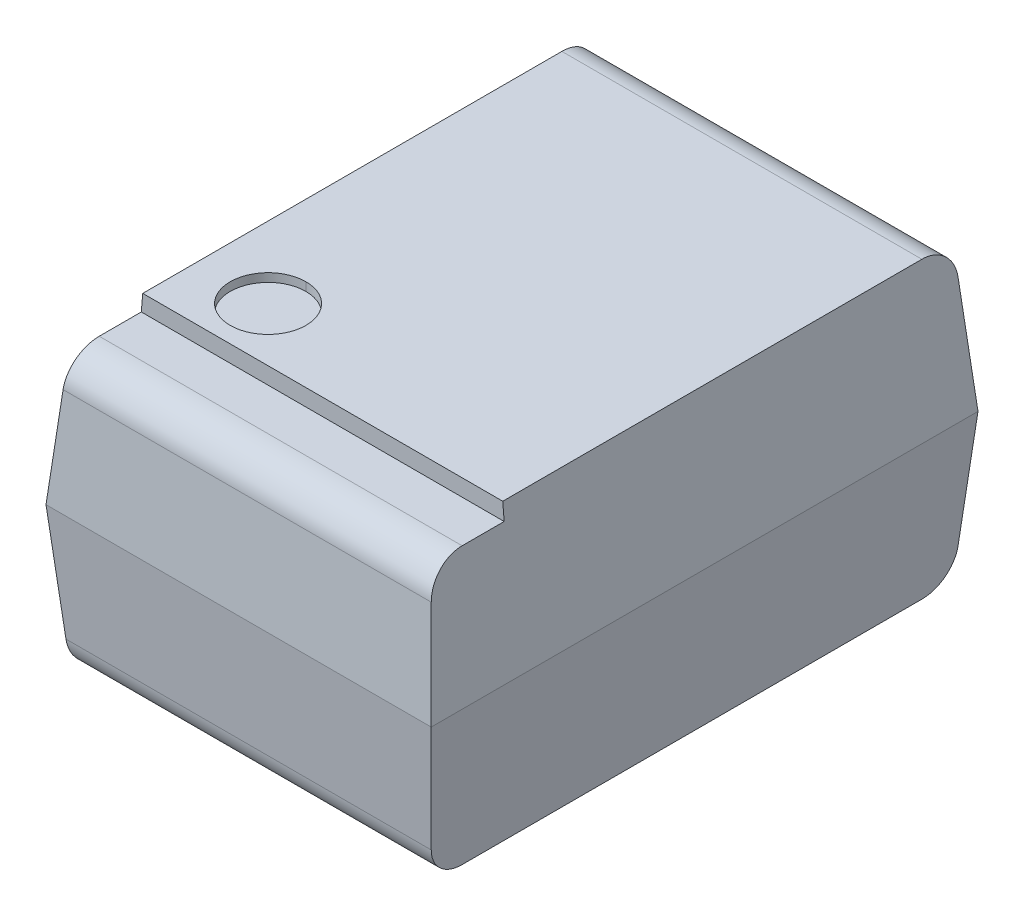
ISO-10303-21;
HEADER;
FILE_DESCRIPTION(('STEP AP214'),'2;1');
FILE_NAME('part.step','',(''),(''),'','','');
FILE_SCHEMA(('AUTOMOTIVE_DESIGN { 1 0 10303 214 1 1 1 1 }'));
ENDSEC;
DATA;
#1=APPLICATION_CONTEXT('core data for automotive mechanical design processes');
#2=APPLICATION_PROTOCOL_DEFINITION('international standard','automotive_design',2000,#1);
#3=PRODUCT_CONTEXT('',#1,'mechanical');
#4=PRODUCT('Part','Part','',(#3));
#5=PRODUCT_RELATED_PRODUCT_CATEGORY('part','',(#4));
#6=PRODUCT_DEFINITION_FORMATION('','',#4);
#7=PRODUCT_DEFINITION_CONTEXT('part definition',#1,'design');
#8=PRODUCT_DEFINITION('design','',#6,#7);
#9=PRODUCT_DEFINITION_SHAPE('','',#8);
#10=(LENGTH_UNIT() NAMED_UNIT(*) SI_UNIT(.MILLI.,.METRE.));
#11=(NAMED_UNIT(*) PLANE_ANGLE_UNIT() SI_UNIT($,.RADIAN.));
#12=(NAMED_UNIT(*) SI_UNIT($,.STERADIAN.) SOLID_ANGLE_UNIT());
#13=UNCERTAINTY_MEASURE_WITH_UNIT(LENGTH_MEASURE(1.E-05),#10,'distance_accuracy_value','');
#14=(GEOMETRIC_REPRESENTATION_CONTEXT(3) GLOBAL_UNCERTAINTY_ASSIGNED_CONTEXT((#13)) GLOBAL_UNIT_ASSIGNED_CONTEXT((#10,
#11,#12)) REPRESENTATION_CONTEXT('',''));
#15=CARTESIAN_POINT('',(0.,0.,0.));
#16=DIRECTION('',(0.,0.,1.));
#17=DIRECTION('',(1.,0.,0.));
#18=AXIS2_PLACEMENT_3D('',#15,#16,#17);
#19=CARTESIAN_POINT('',(-1.29,10.4377154649539,1.61));
#20=DIRECTION('',(0.,-1.,0.));
#21=DIRECTION('',(0.,0.,-1.));
#22=AXIS2_PLACEMENT_3D('',#19,#20,#21);
#23=CYLINDRICAL_SURFACE('',#22,0.45);
#24=CARTESIAN_POINT('',(-1.29,1.75,1.61));
#25=DIRECTION('',(0.,-1.,0.));
#26=DIRECTION('',(0.,0.,-1.));
#27=AXIS2_PLACEMENT_3D('',#24,#25,#26);
#28=CIRCLE('',#27,0.45);
#29=CARTESIAN_POINT('',(-1.29,1.75,2.06));
#30=VERTEX_POINT('',#29);
#31=CARTESIAN_POINT('',(-1.29,1.75,1.16));
#32=VERTEX_POINT('',#31);
#33=EDGE_CURVE('E11',#30,#32,#28,.T.);
#34=ORIENTED_EDGE('',*,*,#33,.F.);
#35=DIRECTION('',(0.,-1.,0.));
#36=VECTOR('',#35,1.);
#37=CARTESIAN_POINT('',(-1.29,10.4377154649539,2.06));
#38=LINE('',#37,#36);
#39=CARTESIAN_POINT('',(-1.29,1.65,2.06));
#40=VERTEX_POINT('',#39);
#41=EDGE_CURVE('E24',#30,#40,#38,.T.);
#42=ORIENTED_EDGE('',*,*,#41,.T.);
#43=CARTESIAN_POINT('',(-1.29,1.65,1.61));
#44=DIRECTION('',(0.,1.,0.));
#45=DIRECTION('',(0.,0.,-1.));
#46=AXIS2_PLACEMENT_3D('',#43,#44,#45);
#47=CIRCLE('',#46,0.45);
#48=CARTESIAN_POINT('',(-1.29,1.65,1.16));
#49=VERTEX_POINT('',#48);
#50=EDGE_CURVE('E305',#49,#40,#47,.T.);
#51=ORIENTED_EDGE('',*,*,#50,.F.);
#52=DIRECTION('',(0.,-1.,0.));
#53=VECTOR('',#52,1.);
#54=CARTESIAN_POINT('',(-1.29,10.4377154649539,1.16));
#55=LINE('',#54,#53);
#56=EDGE_CURVE('E37',#32,#49,#55,.T.);
#57=ORIENTED_EDGE('',*,*,#56,.F.);
#58=EDGE_LOOP('',(#34,#42,#51,#57));
#59=FACE_BOUND('',#58,.T.);
#60=ADVANCED_FACE('F17',(#59),#23,.F.);
#61=CARTESIAN_POINT('',(0.,-10.4377154649539,0.));
#62=DIRECTION('',(0.,1.,0.));
#63=DIRECTION('',(0.,0.,1.));
#64=AXIS2_PLACEMENT_3D('',#61,#62,#63);
#65=CYLINDRICAL_SURFACE('',#64,1.5);
#66=CARTESIAN_POINT('',(0.,-1.75,0.));
#67=DIRECTION('',(0.,-1.,0.));
#68=DIRECTION('',(0.,0.,1.));
#69=AXIS2_PLACEMENT_3D('',#66,#67,#68);
#70=CIRCLE('',#69,1.5);
#71=CARTESIAN_POINT('',(0.,-1.75,1.5));
#72=VERTEX_POINT('',#71);
#73=CARTESIAN_POINT('',(0.,-1.75,-1.5));
#74=VERTEX_POINT('',#73);
#75=EDGE_CURVE('E301',#72,#74,#70,.T.);
#76=ORIENTED_EDGE('',*,*,#75,.T.);
#77=DIRECTION('',(0.,1.,0.));
#78=VECTOR('',#77,1.);
#79=CARTESIAN_POINT('',(0.,-10.4377154649539,-1.5));
#80=LINE('',#79,#78);
#81=CARTESIAN_POINT('',(0.,-1.65,-1.5));
#82=VERTEX_POINT('',#81);
#83=EDGE_CURVE('E298',#74,#82,#80,.T.);
#84=ORIENTED_EDGE('',*,*,#83,.T.);
#85=CARTESIAN_POINT('',(0.,-1.65,0.));
#86=DIRECTION('',(0.,-1.,0.));
#87=DIRECTION('',(0.,0.,1.));
#88=AXIS2_PLACEMENT_3D('',#85,#86,#87);
#89=CIRCLE('',#88,1.5);
#90=CARTESIAN_POINT('',(0.,-1.65,1.5));
#91=VERTEX_POINT('',#90);
#92=EDGE_CURVE('E296',#91,#82,#89,.T.);
#93=ORIENTED_EDGE('',*,*,#92,.F.);
#94=DIRECTION('',(0.,1.,0.));
#95=VECTOR('',#94,1.);
#96=CARTESIAN_POINT('',(0.,-10.4377154649539,1.5));
#97=LINE('',#96,#95);
#98=EDGE_CURVE('E294',#72,#91,#97,.T.);
#99=ORIENTED_EDGE('',*,*,#98,.F.);
#100=EDGE_LOOP('',(#76,#84,#93,#99));
#101=FACE_BOUND('',#100,.T.);
#102=ADVANCED_FACE('F325',(#101),#65,.F.);
#103=CARTESIAN_POINT('',(0.,1.75,0.));
#104=DIRECTION('',(0.,1.,0.));
#105=DIRECTION('',(0.,0.,1.));
#106=AXIS2_PLACEMENT_3D('',#103,#104,#105);
#107=PLANE('',#106);
#108=CARTESIAN_POINT('',(-1.29,1.75,1.61));
#109=DIRECTION('',(0.,-1.,0.));
#110=DIRECTION('',(0.,0.,-1.));
#111=AXIS2_PLACEMENT_3D('',#108,#109,#110);
#112=CIRCLE('',#111,0.45);
#113=EDGE_CURVE('E291',#32,#30,#112,.T.);
#114=ORIENTED_EDGE('',*,*,#113,.T.);
#115=ORIENTED_EDGE('',*,*,#33,.T.);
#116=EDGE_LOOP('',(#114,#115));
#117=FACE_BOUND('',#116,.T.);
#118=DIRECTION('',(1.,0.,0.));
#119=VECTOR('',#118,1.);
#120=CARTESIAN_POINT('',(0.,1.75,2.25));
#121=LINE('',#120,#119);
#122=CARTESIAN_POINT('',(-2.14,1.75,2.25));
#123=VERTEX_POINT('',#122);
#124=CARTESIAN_POINT('',(2.14,1.75,2.25));
#125=VERTEX_POINT('',#124);
#126=EDGE_CURVE('E289',#123,#125,#121,.T.);
#127=ORIENTED_EDGE('',*,*,#126,.T.);
#128=DIRECTION('',(0.,0.,-1.));
#129=VECTOR('',#128,1.);
#130=CARTESIAN_POINT('',(2.14,1.75,0.));
#131=LINE('',#130,#129);
#132=CARTESIAN_POINT('',(2.14,1.75,-2.73281901553713));
#133=VERTEX_POINT('',#132);
#134=EDGE_CURVE('E287',#125,#133,#131,.T.);
#135=ORIENTED_EDGE('',*,*,#134,.T.);
#136=DIRECTION('',(-1.,0.,0.));
#137=VECTOR('',#136,1.);
#138=CARTESIAN_POINT('',(0.,1.75,-2.73281901553713));
#139=LINE('',#138,#137);
#140=CARTESIAN_POINT('',(-2.14,1.75,-2.73281901553713));
#141=VERTEX_POINT('',#140);
#142=EDGE_CURVE('E285',#133,#141,#139,.T.);
#143=ORIENTED_EDGE('',*,*,#142,.T.);
#144=DIRECTION('',(0.,0.,1.));
#145=VECTOR('',#144,1.);
#146=CARTESIAN_POINT('',(-2.14,1.75,0.));
#147=LINE('',#146,#145);
#148=EDGE_CURVE('E282',#141,#123,#147,.T.);
#149=ORIENTED_EDGE('',*,*,#148,.T.);
#150=EDGE_LOOP('',(#127,#135,#143,#149));
#151=FACE_BOUND('',#150,.T.);
#152=ADVANCED_FACE('F329',(#117,#151),#107,.T.);
#153=CARTESIAN_POINT('',(-1.29,10.4377154649539,1.61));
#154=DIRECTION('',(0.,-1.,0.));
#155=DIRECTION('',(0.,0.,-1.));
#156=AXIS2_PLACEMENT_3D('',#153,#154,#155);
#157=CYLINDRICAL_SURFACE('',#156,0.45);
#158=ORIENTED_EDGE('',*,*,#41,.F.);
#159=ORIENTED_EDGE('',*,*,#113,.F.);
#160=ORIENTED_EDGE('',*,*,#56,.T.);
#161=CARTESIAN_POINT('',(-1.29,1.65,1.61));
#162=DIRECTION('',(0.,1.,0.));
#163=DIRECTION('',(0.,0.,-1.));
#164=AXIS2_PLACEMENT_3D('',#161,#162,#163);
#165=CIRCLE('',#164,0.45);
#166=EDGE_CURVE('E279',#40,#49,#165,.T.);
#167=ORIENTED_EDGE('',*,*,#166,.F.);
#168=EDGE_LOOP('',(#158,#159,#160,#167));
#169=FACE_BOUND('',#168,.T.);
#170=ADVANCED_FACE('F306',(#169),#157,.F.);
#171=CARTESIAN_POINT('',(2.29,0.,3.25));
#172=DIRECTION('',(0.996346649041751,0.085401141346437,0.));
#173=DIRECTION('',(-0.085401141346437,0.996346649041751,0.));
#174=AXIS2_PLACEMENT_3D('',#171,#172,#173);
#175=PLANE('',#174);
#176=DIRECTION('',(0.,0.,-1.));
#177=VECTOR('',#176,1.);
#178=CARTESIAN_POINT('',(2.29,0.,3.25));
#179=LINE('',#178,#177);
#180=CARTESIAN_POINT('',(2.29,0.,3.25));
#181=VERTEX_POINT('',#180);
#182=CARTESIAN_POINT('',(2.29,0.,-3.25));
#183=VERTEX_POINT('',#182);
#184=EDGE_CURVE('E277',#181,#183,#179,.T.);
#185=ORIENTED_EDGE('',*,*,#184,.T.);
#186=DIRECTION('',(0.0850914041696108,-0.992733048645449,-0.0850914041696102));
#187=VECTOR('',#186,1.);
#188=CARTESIAN_POINT('',(2.17135767515384,1.38416045653857,-3.13135767515384));
#189=LINE('',#188,#187);
#190=CARTESIAN_POINT('',(2.17135767515384,1.38416045653857,-3.13135767515384));
#191=VERTEX_POINT('',#190);
#192=EDGE_CURVE('E271',#191,#183,#189,.T.);
#193=ORIENTED_EDGE('',*,*,#192,.F.);
#194=CARTESIAN_POINT('',(2.17135767515384,1.38416045653857,-3.13135767515384));
#195=CARTESIAN_POINT('',(2.15267814672051,1.60208828826077,-3.1126781467205));
#196=CARTESIAN_POINT('',(2.14,1.75,-2.9515459334545));
#197=CARTESIAN_POINT('',(2.14,1.75,-2.73281901553713));
#198=(BOUNDED_CURVE() B_SPLINE_CURVE(3,(#194,#195,#196,#197),.UNSPECIFIED.,.F.,
.F.) B_SPLINE_CURVE_WITH_KNOTS((4,4),(4.79789427406289,6.28318530717958),
.UNSPECIFIED.) CURVE() GEOMETRIC_REPRESENTATION_ITEM() RATIONAL_B_SPLINE_CURVE((1.,
0.8244547578635,0.8244547578635,1.)) REPRESENTATION_ITEM(''));
#199=EDGE_CURVE('E266',#191,#133,#198,.T.);
#200=ORIENTED_EDGE('',*,*,#199,.T.);
#201=ORIENTED_EDGE('',*,*,#134,.F.);
#202=DIRECTION('',(0.085401141346437,-0.996346649041751,0.));
#203=VECTOR('',#202,1.);
#204=CARTESIAN_POINT('',(2.29,0.,2.25));
#205=LINE('',#204,#203);
#206=CARTESIAN_POINT('',(2.15714285714285,1.55,2.25));
#207=VERTEX_POINT('',#206);
#208=EDGE_CURVE('E264',#125,#207,#205,.T.);
#209=ORIENTED_EDGE('',*,*,#208,.T.);
#210=DIRECTION('',(0.,0.,1.));
#211=VECTOR('',#210,1.);
#212=CARTESIAN_POINT('',(2.15714285714285,1.55,2.25));
#213=LINE('',#212,#211);
#214=CARTESIAN_POINT('',(2.15714285714285,1.55,2.74996187267999));
#215=VERTEX_POINT('',#214);
#216=EDGE_CURVE('E259',#207,#215,#213,.T.);
#217=ORIENTED_EDGE('',*,*,#216,.T.);
#218=CARTESIAN_POINT('',(2.18850053229669,1.18416045653857,3.14850053229669));
#219=CARTESIAN_POINT('',(2.16982100386336,1.40208828826077,3.12982100386336));
#220=CARTESIAN_POINT('',(2.15714285714285,1.55,2.96868879059736));
#221=CARTESIAN_POINT('',(2.15714285714285,1.55,2.74996187267999));
#222=(BOUNDED_CURVE() B_SPLINE_CURVE(3,(#218,#219,#220,#221),.UNSPECIFIED.,.F.,
.F.) B_SPLINE_CURVE_WITH_KNOTS((4,4),(4.7978942740629,6.28318530717959),
.UNSPECIFIED.) CURVE() GEOMETRIC_REPRESENTATION_ITEM() RATIONAL_B_SPLINE_CURVE((1.,
0.824454757863502,0.824454757863502,1.)) REPRESENTATION_ITEM(''));
#223=CARTESIAN_POINT('',(2.18850053229669,1.18416045653857,3.14850053229669));
#224=VERTEX_POINT('',#223);
#225=EDGE_CURVE('E254',#224,#215,#222,.T.);
#226=ORIENTED_EDGE('',*,*,#225,.F.);
#227=DIRECTION('',(-0.0850914041696092,0.992733048645449,-0.0850914041696103));
#228=VECTOR('',#227,1.);
#229=CARTESIAN_POINT('',(2.29,0.,3.25));
#230=LINE('',#229,#228);
#231=EDGE_CURVE('E251',#181,#224,#230,.T.);
#232=ORIENTED_EDGE('',*,*,#231,.F.);
#233=EDGE_LOOP('',(#185,#193,#200,#201,#209,#217,#226,#232));
#234=FACE_BOUND('',#233,.T.);
#235=ADVANCED_FACE('F339',(#234),#175,.T.);
#236=CARTESIAN_POINT('',(-2.291,1.75,2.25));
#237=DIRECTION('',(0.,0.,-1.));
#238=DIRECTION('',(-1.,0.,0.));
#239=AXIS2_PLACEMENT_3D('',#236,#237,#238);
#240=PLANE('',#239);
#241=DIRECTION('',(-1.,0.,0.));
#242=VECTOR('',#241,1.);
#243=CARTESIAN_POINT('',(-2.291,1.55,2.25));
#244=LINE('',#243,#242);
#245=CARTESIAN_POINT('',(-2.15714285714286,1.55,2.25));
#246=VERTEX_POINT('',#245);
#247=EDGE_CURVE('E249',#207,#246,#244,.T.);
#248=ORIENTED_EDGE('',*,*,#247,.F.);
#249=ORIENTED_EDGE('',*,*,#208,.F.);
#250=ORIENTED_EDGE('',*,*,#126,.F.);
#251=DIRECTION('',(0.0854011413464355,0.996346649041751,0.));
#252=VECTOR('',#251,1.);
#253=CARTESIAN_POINT('',(-2.15714285714286,1.55,2.25));
#254=LINE('',#253,#252);
#255=EDGE_CURVE('E243',#246,#123,#254,.T.);
#256=ORIENTED_EDGE('',*,*,#255,.F.);
#257=EDGE_LOOP('',(#248,#249,#250,#256));
#258=FACE_BOUND('',#257,.T.);
#259=ADVANCED_FACE('F342',(#258),#240,.F.);
#260=CARTESIAN_POINT('',(-2.29,0.,-3.25));
#261=DIRECTION('',(-0.996346649041751,0.085401141346436,0.));
#262=DIRECTION('',(-0.085401141346436,-0.996346649041751,0.));
#263=AXIS2_PLACEMENT_3D('',#260,#261,#262);
#264=PLANE('',#263);
#265=ORIENTED_EDGE('',*,*,#255,.T.);
#266=ORIENTED_EDGE('',*,*,#148,.F.);
#267=CARTESIAN_POINT('',(-2.14,1.75,-2.73281901553713));
#268=CARTESIAN_POINT('',(-2.14,1.75,-2.9515459334545));
#269=CARTESIAN_POINT('',(-2.1526781467205,1.60208828826077,-3.11267814672051));
#270=CARTESIAN_POINT('',(-2.17135767515384,1.38416045653857,-3.13135767515384));
#271=(BOUNDED_CURVE() B_SPLINE_CURVE(3,(#267,#268,#269,#270),.UNSPECIFIED.,.F.,
.F.) B_SPLINE_CURVE_WITH_KNOTS((4,4),(3.14159265358979,4.62688368670648),
.UNSPECIFIED.) CURVE() GEOMETRIC_REPRESENTATION_ITEM() RATIONAL_B_SPLINE_CURVE((1.,
0.824454757863501,0.824454757863501,1.)) REPRESENTATION_ITEM(''));
#272=CARTESIAN_POINT('',(-2.17135767515384,1.38416045653857,-3.13135767515384));
#273=VERTEX_POINT('',#272);
#274=EDGE_CURVE('E239',#141,#273,#271,.T.);
#275=ORIENTED_EDGE('',*,*,#274,.T.);
#276=DIRECTION('',(0.0850914041696098,0.992733048645449,0.0850914041696101));
#277=VECTOR('',#276,1.);
#278=CARTESIAN_POINT('',(-2.29,0.,-3.25));
#279=LINE('',#278,#277);
#280=CARTESIAN_POINT('',(-2.29,0.,-3.25));
#281=VERTEX_POINT('',#280);
#282=EDGE_CURVE('E236',#281,#273,#279,.T.);
#283=ORIENTED_EDGE('',*,*,#282,.F.);
#284=DIRECTION('',(0.,0.,1.));
#285=VECTOR('',#284,1.);
#286=CARTESIAN_POINT('',(-2.29,0.,-3.25));
#287=LINE('',#286,#285);
#288=CARTESIAN_POINT('',(-2.29,0.,3.25));
#289=VERTEX_POINT('',#288);
#290=EDGE_CURVE('E234',#281,#289,#287,.T.);
#291=ORIENTED_EDGE('',*,*,#290,.T.);
#292=DIRECTION('',(-0.0850914041696103,-0.992733048645449,0.0850914041696103));
#293=VECTOR('',#292,1.);
#294=CARTESIAN_POINT('',(-2.18850053229669,1.18416045653857,3.14850053229669));
#295=LINE('',#294,#293);
#296=CARTESIAN_POINT('',(-2.1885005322967,1.18416045653857,3.14850053229669));
#297=VERTEX_POINT('',#296);
#298=EDGE_CURVE('E228',#297,#289,#295,.T.);
#299=ORIENTED_EDGE('',*,*,#298,.F.);
#300=CARTESIAN_POINT('',(-2.15714285714286,1.55,2.74996187267999));
#301=CARTESIAN_POINT('',(-2.15714285714286,1.55,2.96868879059736));
#302=CARTESIAN_POINT('',(-2.16982100386336,1.40208828826077,3.12982100386336));
#303=CARTESIAN_POINT('',(-2.1885005322967,1.18416045653857,3.14850053229669));
#304=(BOUNDED_CURVE() B_SPLINE_CURVE(3,(#300,#301,#302,#303),.UNSPECIFIED.,.F.,
.F.) B_SPLINE_CURVE_WITH_KNOTS((4,4),(3.1415926535898,4.62688368670649),
.UNSPECIFIED.) CURVE() GEOMETRIC_REPRESENTATION_ITEM() RATIONAL_B_SPLINE_CURVE((1.,
0.824454757863501,0.824454757863501,1.)) REPRESENTATION_ITEM(''));
#305=CARTESIAN_POINT('',(-2.15714285714286,1.55,2.74996187267999));
#306=VERTEX_POINT('',#305);
#307=EDGE_CURVE('E223',#306,#297,#304,.T.);
#308=ORIENTED_EDGE('',*,*,#307,.F.);
#309=DIRECTION('',(0.,0.,-1.));
#310=VECTOR('',#309,1.);
#311=CARTESIAN_POINT('',(-2.15714285714286,1.55,-3.25));
#312=LINE('',#311,#310);
#313=EDGE_CURVE('E220',#306,#246,#312,.T.);
#314=ORIENTED_EDGE('',*,*,#313,.T.);
#315=EDGE_LOOP('',(#265,#266,#275,#283,#291,#299,#308,#314));
#316=FACE_BOUND('',#315,.T.);
#317=ADVANCED_FACE('F321',(#316),#264,.T.);
#318=CARTESIAN_POINT('',(1.145,1.35,-2.73281901553713));
#319=DIRECTION('',(-1.,0.,0.));
#320=DIRECTION('',(0.,0.,1.));
#321=AXIS2_PLACEMENT_3D('',#318,#319,#320);
#322=CYLINDRICAL_SURFACE('',#321,0.4);
#323=ORIENTED_EDGE('',*,*,#199,.F.);
#324=DIRECTION('',(-1.,0.,0.));
#325=VECTOR('',#324,1.);
#326=CARTESIAN_POINT('',(1.145,1.38416045653857,-3.13135767515384));
#327=LINE('',#326,#325);
#328=EDGE_CURVE('E214',#191,#273,#327,.T.);
#329=ORIENTED_EDGE('',*,*,#328,.T.);
#330=ORIENTED_EDGE('',*,*,#274,.F.);
#331=ORIENTED_EDGE('',*,*,#142,.F.);
#332=EDGE_LOOP('',(#323,#329,#330,#331));
#333=FACE_BOUND('',#332,.T.);
#334=ADVANCED_FACE('F311',(#333),#322,.T.);
#335=CARTESIAN_POINT('',(0.,1.65,0.));
#336=DIRECTION('',(0.,1.,0.));
#337=DIRECTION('',(0.,0.,1.));
#338=AXIS2_PLACEMENT_3D('',#335,#336,#337);
#339=PLANE('',#338);
#340=ORIENTED_EDGE('',*,*,#50,.T.);
#341=ORIENTED_EDGE('',*,*,#166,.T.);
#342=EDGE_LOOP('',(#340,#341));
#343=FACE_BOUND('',#342,.T.);
#344=ADVANCED_FACE('F308',(#343),#339,.T.);
#345=CARTESIAN_POINT('',(2.29,0.,-3.25));
#346=DIRECTION('',(0.996346649041751,-0.085401141346436,0.));
#347=DIRECTION('',(0.085401141346436,0.996346649041751,0.));
#348=AXIS2_PLACEMENT_3D('',#345,#346,#347);
#349=PLANE('',#348);
#350=CARTESIAN_POINT('',(2.14,-1.75,2.73281901553713));
#351=CARTESIAN_POINT('',(2.14,-1.75,2.9515459334545));
#352=CARTESIAN_POINT('',(2.1526781467205,-1.60208828826077,3.1126781467205));
#353=CARTESIAN_POINT('',(2.17135767515384,-1.38416045653857,3.13135767515384));
#354=(BOUNDED_CURVE() B_SPLINE_CURVE(3,(#350,#351,#352,#353),.UNSPECIFIED.,.F.,
.F.) B_SPLINE_CURVE_WITH_KNOTS((4,4),(0.,1.48529103311669),
.UNSPECIFIED.) CURVE() GEOMETRIC_REPRESENTATION_ITEM() RATIONAL_B_SPLINE_CURVE((1.,
0.824454757863502,0.824454757863502,1.)) REPRESENTATION_ITEM(''));
#355=CARTESIAN_POINT('',(2.14,-1.75,2.73281901553713));
#356=VERTEX_POINT('',#355);
#357=CARTESIAN_POINT('',(2.17135767515384,-1.38416045653857,3.13135767515384));
#358=VERTEX_POINT('',#357);
#359=EDGE_CURVE('E152',#356,#358,#354,.T.);
#360=ORIENTED_EDGE('',*,*,#359,.F.);
#361=DIRECTION('',(0.,0.,-1.));
#362=VECTOR('',#361,1.);
#363=CARTESIAN_POINT('',(2.14,-1.75,-3.25));
#364=LINE('',#363,#362);
#365=CARTESIAN_POINT('',(2.14,-1.75,-2.73281901553714));
#366=VERTEX_POINT('',#365);
#367=EDGE_CURVE('E206',#356,#366,#364,.T.);
#368=ORIENTED_EDGE('',*,*,#367,.T.);
#369=CARTESIAN_POINT('',(2.17135767515384,-1.38416045653857,-3.13135767515384));
#370=CARTESIAN_POINT('',(2.15267814672051,-1.60208828826077,-3.11267814672051));
#371=CARTESIAN_POINT('',(2.14,-1.75,-2.9515459334545));
#372=CARTESIAN_POINT('',(2.14,-1.75,-2.73281901553714));
#373=(BOUNDED_CURVE() B_SPLINE_CURVE(3,(#369,#370,#371,#372),.UNSPECIFIED.,.F.,
.F.) B_SPLINE_CURVE_WITH_KNOTS((4,4),(1.6563016204731,3.14159265358979),
.UNSPECIFIED.) CURVE() GEOMETRIC_REPRESENTATION_ITEM() RATIONAL_B_SPLINE_CURVE((1.,
0.824454757863501,0.824454757863501,1.)) REPRESENTATION_ITEM(''));
#374=CARTESIAN_POINT('',(2.17135767515384,-1.38416045653857,-3.13135767515384));
#375=VERTEX_POINT('',#374);
#376=EDGE_CURVE('E201',#375,#366,#373,.T.);
#377=ORIENTED_EDGE('',*,*,#376,.F.);
#378=DIRECTION('',(-0.0850914041696111,-0.992733048645449,0.0850914041696102));
#379=VECTOR('',#378,1.);
#380=CARTESIAN_POINT('',(2.29,0.,-3.25));
#381=LINE('',#380,#379);
#382=EDGE_CURVE('E198',#183,#375,#381,.T.);
#383=ORIENTED_EDGE('',*,*,#382,.F.);
#384=ORIENTED_EDGE('',*,*,#184,.F.);
#385=DIRECTION('',(0.0850914041696096,0.992733048645449,0.0850914041696102));
#386=VECTOR('',#385,1.);
#387=CARTESIAN_POINT('',(2.17135767515384,-1.38416045653857,3.13135767515384));
#388=LINE('',#387,#386);
#389=EDGE_CURVE('E196',#358,#181,#388,.T.);
#390=ORIENTED_EDGE('',*,*,#389,.F.);
#391=EDGE_LOOP('',(#360,#368,#377,#383,#384,#390));
#392=FACE_BOUND('',#391,.T.);
#393=ADVANCED_FACE('F310',(#392),#349,.T.);
#394=CARTESIAN_POINT('',(-2.291,1.55,2.25));
#395=DIRECTION('',(0.,-1.,0.));
#396=DIRECTION('',(0.,0.,-1.));
#397=AXIS2_PLACEMENT_3D('',#394,#395,#396);
#398=PLANE('',#397);
#399=ORIENTED_EDGE('',*,*,#216,.F.);
#400=ORIENTED_EDGE('',*,*,#247,.T.);
#401=ORIENTED_EDGE('',*,*,#313,.F.);
#402=DIRECTION('',(-1.,0.,0.));
#403=VECTOR('',#402,1.);
#404=CARTESIAN_POINT('',(-2.291,1.55,2.74996187267999));
#405=LINE('',#404,#403);
#406=EDGE_CURVE('E193',#215,#306,#405,.T.);
#407=ORIENTED_EDGE('',*,*,#406,.F.);
#408=EDGE_LOOP('',(#399,#400,#401,#407));
#409=FACE_BOUND('',#408,.T.);
#410=ADVANCED_FACE('F318',(#409),#398,.F.);
#411=CARTESIAN_POINT('',(-2.29,0.,3.25));
#412=DIRECTION('',(-0.996346649041751,-0.085401141346436,0.));
#413=DIRECTION('',(0.085401141346436,-0.996346649041751,0.));
#414=AXIS2_PLACEMENT_3D('',#411,#412,#413);
#415=PLANE('',#414);
#416=ORIENTED_EDGE('',*,*,#290,.F.);
#417=DIRECTION('',(-0.0850914041696102,0.992733048645449,-0.0850914041696102));
#418=VECTOR('',#417,1.);
#419=CARTESIAN_POINT('',(-2.17135767515384,-1.38416045653857,-3.13135767515384));
#420=LINE('',#419,#418);
#421=CARTESIAN_POINT('',(-2.17135767515384,-1.38416045653857,-3.13135767515384));
#422=VERTEX_POINT('',#421);
#423=EDGE_CURVE('E187',#422,#281,#420,.T.);
#424=ORIENTED_EDGE('',*,*,#423,.F.);
#425=CARTESIAN_POINT('',(-2.14,-1.75,-2.73281901553714));
#426=CARTESIAN_POINT('',(-2.14,-1.75,-2.9515459334545));
#427=CARTESIAN_POINT('',(-2.1526781467205,-1.60208828826077,-3.11267814672051));
#428=CARTESIAN_POINT('',(-2.17135767515384,-1.38416045653857,-3.13135767515384));
#429=(BOUNDED_CURVE() B_SPLINE_CURVE(3,(#425,#426,#427,#428),.UNSPECIFIED.,.F.,
.F.) B_SPLINE_CURVE_WITH_KNOTS((4,4),(0.,1.48529103311669),
.UNSPECIFIED.) CURVE() GEOMETRIC_REPRESENTATION_ITEM() RATIONAL_B_SPLINE_CURVE((1.,
0.824454757863501,0.824454757863501,1.)) REPRESENTATION_ITEM(''));
#430=CARTESIAN_POINT('',(-2.14,-1.75,-2.73281901553714));
#431=VERTEX_POINT('',#430);
#432=EDGE_CURVE('E182',#431,#422,#429,.T.);
#433=ORIENTED_EDGE('',*,*,#432,.F.);
#434=DIRECTION('',(0.,0.,1.));
#435=VECTOR('',#434,1.);
#436=CARTESIAN_POINT('',(-2.14,-1.75,3.25));
#437=LINE('',#436,#435);
#438=CARTESIAN_POINT('',(-2.14,-1.75,2.73281901553713));
#439=VERTEX_POINT('',#438);
#440=EDGE_CURVE('E136',#431,#439,#437,.T.);
#441=ORIENTED_EDGE('',*,*,#440,.T.);
#442=CARTESIAN_POINT('',(-2.17135767515384,-1.38416045653857,3.13135767515384));
#443=CARTESIAN_POINT('',(-2.15267814672051,-1.60208828826077,3.11267814672051));
#444=CARTESIAN_POINT('',(-2.14,-1.75,2.9515459334545));
#445=CARTESIAN_POINT('',(-2.14,-1.75,2.73281901553713));
#446=(BOUNDED_CURVE() B_SPLINE_CURVE(3,(#442,#443,#444,#445),.UNSPECIFIED.,.F.,
.F.) B_SPLINE_CURVE_WITH_KNOTS((4,4),(1.6563016204731,3.14159265358979),
.UNSPECIFIED.) CURVE() GEOMETRIC_REPRESENTATION_ITEM() RATIONAL_B_SPLINE_CURVE((1.,
0.824454757863501,0.824454757863501,1.)) REPRESENTATION_ITEM(''));
#447=CARTESIAN_POINT('',(-2.17135767515384,-1.38416045653857,3.13135767515384));
#448=VERTEX_POINT('',#447);
#449=EDGE_CURVE('E129',#448,#439,#446,.T.);
#450=ORIENTED_EDGE('',*,*,#449,.F.);
#451=DIRECTION('',(0.0850914041696099,-0.992733048645449,-0.0850914041696102));
#452=VECTOR('',#451,1.);
#453=CARTESIAN_POINT('',(-2.29,0.,3.25));
#454=LINE('',#453,#452);
#455=EDGE_CURVE('E133',#289,#448,#454,.T.);
#456=ORIENTED_EDGE('',*,*,#455,.F.);
#457=EDGE_LOOP('',(#416,#424,#433,#441,#450,#456));
#458=FACE_BOUND('',#457,.T.);
#459=ADVANCED_FACE('F132',(#458),#415,.T.);
#460=CARTESIAN_POINT('',(2.29,0.,-3.25));
#461=DIRECTION('',(0.,0.085401141346436,-0.996346649041751));
#462=DIRECTION('',(0.,0.996346649041751,0.085401141346436));
#463=AXIS2_PLACEMENT_3D('',#460,#461,#462);
#464=PLANE('',#463);
#465=DIRECTION('',(-1.,0.,0.));
#466=VECTOR('',#465,1.);
#467=CARTESIAN_POINT('',(2.29,0.,-3.25));
#468=LINE('',#467,#466);
#469=EDGE_CURVE('E149',#183,#281,#468,.T.);
#470=ORIENTED_EDGE('',*,*,#469,.T.);
#471=ORIENTED_EDGE('',*,*,#282,.T.);
#472=ORIENTED_EDGE('',*,*,#328,.F.);
#473=ORIENTED_EDGE('',*,*,#192,.T.);
#474=EDGE_LOOP('',(#470,#471,#472,#473));
#475=FACE_BOUND('',#474,.T.);
#476=ADVANCED_FACE('F365',(#475),#464,.T.);
#477=CARTESIAN_POINT('',(0.,-1.75,0.));
#478=DIRECTION('',(0.,1.,0.));
#479=DIRECTION('',(0.,0.,1.));
#480=AXIS2_PLACEMENT_3D('',#477,#478,#479);
#481=PLANE('',#480);
#482=ORIENTED_EDGE('',*,*,#75,.F.);
#483=CARTESIAN_POINT('',(0.,-1.75,0.));
#484=DIRECTION('',(0.,-1.,0.));
#485=DIRECTION('',(0.,0.,1.));
#486=AXIS2_PLACEMENT_3D('',#483,#484,#485);
#487=CIRCLE('',#486,1.5);
#488=EDGE_CURVE('E171',#74,#72,#487,.T.);
#489=ORIENTED_EDGE('',*,*,#488,.F.);
#490=EDGE_LOOP('',(#482,#489));
#491=FACE_BOUND('',#490,.T.);
#492=ORIENTED_EDGE('',*,*,#367,.F.);
#493=DIRECTION('',(1.,0.,0.));
#494=VECTOR('',#493,1.);
#495=CARTESIAN_POINT('',(0.,-1.75,2.73281901553713));
#496=LINE('',#495,#494);
#497=EDGE_CURVE('E169',#439,#356,#496,.T.);
#498=ORIENTED_EDGE('',*,*,#497,.F.);
#499=ORIENTED_EDGE('',*,*,#440,.F.);
#500=DIRECTION('',(-1.,0.,0.));
#501=VECTOR('',#500,1.);
#502=CARTESIAN_POINT('',(0.,-1.75,-2.73281901553713));
#503=LINE('',#502,#501);
#504=EDGE_CURVE('E166',#366,#431,#503,.T.);
#505=ORIENTED_EDGE('',*,*,#504,.F.);
#506=EDGE_LOOP('',(#492,#498,#499,#505));
#507=FACE_BOUND('',#506,.T.);
#508=ADVANCED_FACE('F375',(#491,#507),#481,.F.);
#509=CARTESIAN_POINT('',(-2.2905,1.15,2.74996187267999));
#510=DIRECTION('',(-1.,0.,0.));
#511=DIRECTION('',(0.,0.,1.));
#512=AXIS2_PLACEMENT_3D('',#509,#510,#511);
#513=CYLINDRICAL_SURFACE('',#512,0.4);
#514=ORIENTED_EDGE('',*,*,#225,.T.);
#515=ORIENTED_EDGE('',*,*,#406,.T.);
#516=ORIENTED_EDGE('',*,*,#307,.T.);
#517=DIRECTION('',(1.,0.,0.));
#518=VECTOR('',#517,1.);
#519=CARTESIAN_POINT('',(-2.2905,1.18416045653857,3.14850053229669));
#520=LINE('',#519,#518);
#521=EDGE_CURVE('E163',#297,#224,#520,.T.);
#522=ORIENTED_EDGE('',*,*,#521,.T.);
#523=EDGE_LOOP('',(#514,#515,#516,#522));
#524=FACE_BOUND('',#523,.T.);
#525=ADVANCED_FACE('F380',(#524),#513,.T.);
#526=CARTESIAN_POINT('',(-2.29,0.,-3.25));
#527=DIRECTION('',(0.,-0.085401141346436,-0.996346649041751));
#528=DIRECTION('',(0.,0.996346649041751,-0.085401141346436));
#529=AXIS2_PLACEMENT_3D('',#526,#527,#528);
#530=PLANE('',#529);
#531=ORIENTED_EDGE('',*,*,#469,.F.);
#532=ORIENTED_EDGE('',*,*,#382,.T.);
#533=DIRECTION('',(-1.,0.,0.));
#534=VECTOR('',#533,1.);
#535=CARTESIAN_POINT('',(-2.29,-1.38416045653857,-3.13135767515384));
#536=LINE('',#535,#534);
#537=EDGE_CURVE('E157',#375,#422,#536,.T.);
#538=ORIENTED_EDGE('',*,*,#537,.T.);
#539=ORIENTED_EDGE('',*,*,#423,.T.);
#540=EDGE_LOOP('',(#531,#532,#538,#539));
#541=FACE_BOUND('',#540,.T.);
#542=ADVANCED_FACE('F369',(#541),#530,.T.);
#543=CARTESIAN_POINT('',(0.,-10.4377154649539,0.));
#544=DIRECTION('',(0.,1.,0.));
#545=DIRECTION('',(0.,0.,1.));
#546=AXIS2_PLACEMENT_3D('',#543,#544,#545);
#547=CYLINDRICAL_SURFACE('',#546,1.5);
#548=ORIENTED_EDGE('',*,*,#83,.F.);
#549=ORIENTED_EDGE('',*,*,#488,.T.);
#550=ORIENTED_EDGE('',*,*,#98,.T.);
#551=CARTESIAN_POINT('',(0.,-1.65,0.));
#552=DIRECTION('',(0.,-1.,0.));
#553=DIRECTION('',(0.,0.,1.));
#554=AXIS2_PLACEMENT_3D('',#551,#552,#553);
#555=CIRCLE('',#554,1.5);
#556=EDGE_CURVE('E154',#82,#91,#555,.T.);
#557=ORIENTED_EDGE('',*,*,#556,.F.);
#558=EDGE_LOOP('',(#548,#549,#550,#557));
#559=FACE_BOUND('',#558,.T.);
#560=ADVANCED_FACE('F400',(#559),#547,.F.);
#561=CARTESIAN_POINT('',(-1.145,-1.35,-2.73281901553714));
#562=DIRECTION('',(1.,0.,0.));
#563=DIRECTION('',(0.,0.,-1.));
#564=AXIS2_PLACEMENT_3D('',#561,#562,#563);
#565=CYLINDRICAL_SURFACE('',#564,0.4);
#566=ORIENTED_EDGE('',*,*,#432,.T.);
#567=ORIENTED_EDGE('',*,*,#537,.F.);
#568=ORIENTED_EDGE('',*,*,#376,.T.);
#569=ORIENTED_EDGE('',*,*,#504,.T.);
#570=EDGE_LOOP('',(#566,#567,#568,#569));
#571=FACE_BOUND('',#570,.T.);
#572=ADVANCED_FACE('F371',(#571),#565,.T.);
#573=CARTESIAN_POINT('',(1.145,-1.35,2.73281901553713));
#574=DIRECTION('',(-1.,0.,0.));
#575=DIRECTION('',(0.,-1.,0.));
#576=AXIS2_PLACEMENT_3D('',#573,#574,#575);
#577=CYLINDRICAL_SURFACE('',#576,0.4);
#578=ORIENTED_EDGE('',*,*,#359,.T.);
#579=DIRECTION('',(-1.,0.,0.));
#580=VECTOR('',#579,1.);
#581=CARTESIAN_POINT('',(1.145,-1.38416045653857,3.13135767515383));
#582=LINE('',#581,#580);
#583=EDGE_CURVE('E146',#358,#448,#582,.T.);
#584=ORIENTED_EDGE('',*,*,#583,.T.);
#585=ORIENTED_EDGE('',*,*,#449,.T.);
#586=ORIENTED_EDGE('',*,*,#497,.T.);
#587=EDGE_LOOP('',(#578,#584,#585,#586));
#588=FACE_BOUND('',#587,.T.);
#589=ADVANCED_FACE('F151',(#588),#577,.T.);
#590=CARTESIAN_POINT('',(-2.29,0.,3.25));
#591=DIRECTION('',(0.,0.085401141346436,0.996346649041751));
#592=DIRECTION('',(0.,-0.996346649041751,0.085401141346436));
#593=AXIS2_PLACEMENT_3D('',#590,#591,#592);
#594=PLANE('',#593);
#595=DIRECTION('',(1.,0.,0.));
#596=VECTOR('',#595,1.);
#597=CARTESIAN_POINT('',(-2.29,0.,3.25));
#598=LINE('',#597,#596);
#599=EDGE_CURVE('E148',#289,#181,#598,.T.);
#600=ORIENTED_EDGE('',*,*,#599,.T.);
#601=ORIENTED_EDGE('',*,*,#231,.T.);
#602=ORIENTED_EDGE('',*,*,#521,.F.);
#603=ORIENTED_EDGE('',*,*,#298,.T.);
#604=EDGE_LOOP('',(#600,#601,#602,#603));
#605=FACE_BOUND('',#604,.T.);
#606=ADVANCED_FACE('F377',(#605),#594,.T.);
#607=CARTESIAN_POINT('',(0.,-1.65,0.));
#608=DIRECTION('',(0.,1.,0.));
#609=DIRECTION('',(0.,0.,1.));
#610=AXIS2_PLACEMENT_3D('',#607,#608,#609);
#611=PLANE('',#610);
#612=ORIENTED_EDGE('',*,*,#92,.T.);
#613=ORIENTED_EDGE('',*,*,#556,.T.);
#614=EDGE_LOOP('',(#612,#613));
#615=FACE_BOUND('',#614,.T.);
#616=ADVANCED_FACE('F410',(#615),#611,.F.);
#617=CARTESIAN_POINT('',(2.29,0.,3.25));
#618=DIRECTION('',(0.,-0.085401141346436,0.996346649041751));
#619=DIRECTION('',(0.,-0.996346649041751,-0.085401141346436));
#620=AXIS2_PLACEMENT_3D('',#617,#618,#619);
#621=PLANE('',#620);
#622=ORIENTED_EDGE('',*,*,#599,.F.);
#623=ORIENTED_EDGE('',*,*,#455,.T.);
#624=ORIENTED_EDGE('',*,*,#583,.F.);
#625=ORIENTED_EDGE('',*,*,#389,.T.);
#626=EDGE_LOOP('',(#622,#623,#624,#625));
#627=FACE_BOUND('',#626,.T.);
#628=ADVANCED_FACE('F144',(#627),#621,.T.);
#629=CLOSED_SHELL('',(#60,#102,#152,#170,#235,#259,#317,#334,#344,#393,#410,#459,#476,#508,#525,
#542,#560,#572,#589,#606,#616,#628));
#630=MANIFOLD_SOLID_BREP('B1',#629);
#631=ADVANCED_BREP_SHAPE_REPRESENTATION('',(#18,#630),#14);
#632=SHAPE_DEFINITION_REPRESENTATION(#9,#631);
ENDSEC;
END-ISO-10303-21;
